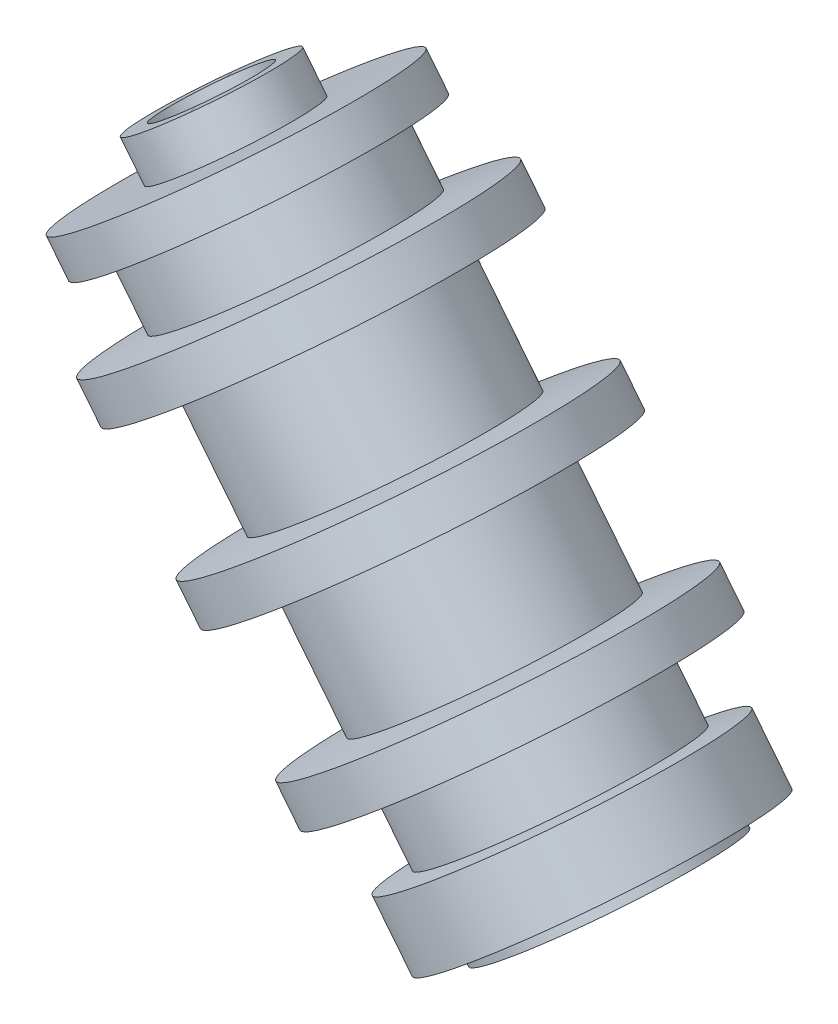
ISO-10303-21;
HEADER;
FILE_DESCRIPTION(('STEP AP214'),'2;1');
FILE_NAME('part.step','',(''),(''),'','','');
FILE_SCHEMA(('AUTOMOTIVE_DESIGN { 1 0 10303 214 1 1 1 1 }'));
ENDSEC;
DATA;
#1=APPLICATION_CONTEXT('core data for automotive mechanical design processes');
#2=APPLICATION_PROTOCOL_DEFINITION('international standard','automotive_design',2000,#1);
#3=PRODUCT_CONTEXT('',#1,'mechanical');
#4=PRODUCT('Part','Part','',(#3));
#5=PRODUCT_RELATED_PRODUCT_CATEGORY('part','',(#4));
#6=PRODUCT_DEFINITION_FORMATION('','',#4);
#7=PRODUCT_DEFINITION_CONTEXT('part definition',#1,'design');
#8=PRODUCT_DEFINITION('design','',#6,#7);
#9=PRODUCT_DEFINITION_SHAPE('','',#8);
#10=(LENGTH_UNIT() NAMED_UNIT(*) SI_UNIT(.MILLI.,.METRE.));
#11=(NAMED_UNIT(*) PLANE_ANGLE_UNIT() SI_UNIT($,.RADIAN.));
#12=(NAMED_UNIT(*) SI_UNIT($,.STERADIAN.) SOLID_ANGLE_UNIT());
#13=UNCERTAINTY_MEASURE_WITH_UNIT(LENGTH_MEASURE(1.E-05),#10,'distance_accuracy_value','');
#14=(GEOMETRIC_REPRESENTATION_CONTEXT(3) GLOBAL_UNCERTAINTY_ASSIGNED_CONTEXT((#13)) GLOBAL_UNIT_ASSIGNED_CONTEXT((#10,
#11,#12)) REPRESENTATION_CONTEXT('',''));
#15=CARTESIAN_POINT('',(0.,0.,0.));
#16=DIRECTION('',(0.,0.,1.));
#17=DIRECTION('',(1.,0.,0.));
#18=AXIS2_PLACEMENT_3D('',#15,#16,#17);
#19=CARTESIAN_POINT('',(18.608083128768,15.1592131152266,0.));
#20=DIRECTION('',(-0.623489801858733,0.78183148246803,0.));
#21=DIRECTION('',(-0.78183148246803,-0.623489801858733,0.));
#22=AXIS2_PLACEMENT_3D('',#19,#20,#21);
#23=CYLINDRICAL_SURFACE('',#22,4.5);
#24=CARTESIAN_POINT('',(19.0757004801351,14.5728395034094,0.));
#25=DIRECTION('',(-0.623489801858733,0.78183148246803,0.));
#26=DIRECTION('',(-0.614587904844371,-0.490117499242376,0.61811531622781));
#27=AXIS2_PLACEMENT_3D('',#24,#25,#26);
#28=CIRCLE('',#27,4.50000000000717);
#29=CARTESIAN_POINT('',(16.310054908331,12.3673107568152,2.78151892302958));
#30=VERTEX_POINT('',#29);
#31=EDGE_CURVE('E105',#30,#30,#28,.F.);
#32=ORIENTED_EDGE('',*,*,#31,.F.);
#33=EDGE_LOOP('',(#32));
#34=FACE_BOUND('',#33,.T.);
#35=CARTESIAN_POINT('',(18.452210678295,15.354670985854,0.));
#36=DIRECTION('',(0.623489801858733,-0.78183148246803,0.));
#37=DIRECTION('',(0.614587904837553,0.49011749923694,-0.6181153162389));
#38=AXIS2_PLACEMENT_3D('',#35,#36,#37);
#39=CIRCLE('',#38,4.5000000000184);
#40=CARTESIAN_POINT('',(21.2178562500753,17.5601997324293,-2.78151892308642));
#41=VERTEX_POINT('',#40);
#42=EDGE_CURVE('E102',#41,#41,#39,.F.);
#43=ORIENTED_EDGE('',*,*,#42,.F.);
#44=EDGE_LOOP('',(#43));
#45=FACE_BOUND('',#44,.T.);
#46=ADVANCED_FACE('F17',(#34,#45),#23,.T.);
#47=CARTESIAN_POINT('',(19.0757004801407,14.5728395034024,0.));
#48=DIRECTION('',(-0.623489801858733,0.78183148246803,0.));
#49=DIRECTION('',(-0.78183148246803,-0.623489801858733,0.));
#50=AXIS2_PLACEMENT_3D('',#47,#48,#49);
#51=CONICAL_SURFACE('',#50,4.50000000014024,1.4835298642031);
#52=ORIENTED_EDGE('',*,*,#31,.T.);
#53=EDGE_LOOP('',(#52));
#54=FACE_BOUND('',#53,.T.);
#55=CARTESIAN_POINT('',(19.1575229143921,14.4702374161202,0.));
#56=DIRECTION('',(-0.623489801858733,0.78183148246803,0.));
#57=DIRECTION('',(-0.78183148246803,-0.623489801858733,0.));
#58=AXIS2_PLACEMENT_3D('',#55,#56,#57);
#59=CIRCLE('',#58,3.);
#60=CARTESIAN_POINT('',(16.812028466988,12.599768010544,0.));
#61=VERTEX_POINT('',#60);
#62=EDGE_CURVE('E99',#61,#61,#59,.F.);
#63=ORIENTED_EDGE('',*,*,#62,.F.);
#64=EDGE_LOOP('',(#63));
#65=FACE_BOUND('',#64,.T.);
#66=ADVANCED_FACE('F229',(#54,#65),#51,.T.);
#67=CARTESIAN_POINT('',(18.452210678295,15.354670985854,0.));
#68=DIRECTION('',(0.623489801858733,-0.78183148246803,0.));
#69=DIRECTION('',(0.78183148246803,0.623489801858733,0.));
#70=AXIS2_PLACEMENT_3D('',#67,#68,#69);
#71=CONICAL_SURFACE('',#70,4.5000000000184,1.4835298642031);
#72=CARTESIAN_POINT('',(18.3703882440733,15.457273073099,0.));
#73=DIRECTION('',(-0.623489801858733,0.78183148246803,0.));
#74=DIRECTION('',(-0.78183148246803,-0.623489801858733,0.));
#75=AXIS2_PLACEMENT_3D('',#72,#73,#74);
#76=CIRCLE('',#75,3.);
#77=CARTESIAN_POINT('',(16.0248937966693,13.5868036675228,0.));
#78=VERTEX_POINT('',#77);
#79=EDGE_CURVE('E96',#78,#78,#76,.T.);
#80=ORIENTED_EDGE('',*,*,#79,.F.);
#81=EDGE_LOOP('',(#80));
#82=FACE_BOUND('',#81,.T.);
#83=ORIENTED_EDGE('',*,*,#42,.T.);
#84=EDGE_LOOP('',(#83));
#85=FACE_BOUND('',#84,.T.);
#86=ADVANCED_FACE('F219',(#82,#85),#71,.T.);
#87=CARTESIAN_POINT('',(21.3202637668535,11.7582461664907,0.));
#88=DIRECTION('',(-0.623489801858733,0.78183148246803,0.));
#89=DIRECTION('',(-0.78183148246803,-0.623489801858733,0.));
#90=AXIS2_PLACEMENT_3D('',#87,#88,#89);
#91=CYLINDRICAL_SURFACE('',#90,3.);
#92=ORIENTED_EDGE('',*,*,#62,.T.);
#93=EDGE_LOOP('',(#92));
#94=FACE_BOUND('',#93,.T.);
#95=CARTESIAN_POINT('',(20.9266964316871,12.2517639949889,0.));
#96=DIRECTION('',(0.623489801858733,-0.78183148246803,0.));
#97=DIRECTION('',(0.614587904834828,0.490117499234766,-0.618115316243333));
#98=AXIS2_PLACEMENT_3D('',#95,#96,#97);
#99=CIRCLE('',#98,2.99999999992945);
#100=CARTESIAN_POINT('',(22.7704601461483,13.7221164926586,-1.85434594868639));
#101=VERTEX_POINT('',#100);
#102=EDGE_CURVE('E79',#101,#101,#99,.T.);
#103=ORIENTED_EDGE('',*,*,#102,.F.);
#104=EDGE_LOOP('',(#103));
#105=FACE_BOUND('',#104,.T.);
#106=ADVANCED_FACE('F217',(#94,#105),#91,.T.);
#107=CARTESIAN_POINT('',(16.2076473916119,18.1692643227285,0.));
#108=DIRECTION('',(-0.623489801858733,0.78183148246803,0.));
#109=DIRECTION('',(-0.78183148246803,-0.623489801858733,0.));
#110=AXIS2_PLACEMENT_3D('',#107,#108,#109);
#111=CYLINDRICAL_SURFACE('',#110,3.);
#112=ORIENTED_EDGE('',*,*,#79,.T.);
#113=EDGE_LOOP('',(#112));
#114=FACE_BOUND('',#113,.T.);
#115=CARTESIAN_POINT('',(16.6012147268205,17.6757464941773,0.));
#116=DIRECTION('',(-0.623489801858733,0.78183148246803,0.));
#117=DIRECTION('',(-0.614587904826093,-0.4901174992278,0.618115316257542));
#118=AXIS2_PLACEMENT_3D('',#115,#116,#117);
#119=CIRCLE('',#118,3.0000000000444);
#120=CARTESIAN_POINT('',(18.4449784413525,19.1460989919035,-1.85434594873922));
#121=VERTEX_POINT('',#120);
#122=CARTESIAN_POINT('',(14.757451012301,16.2053939964866,1.85434594877972));
#123=VERTEX_POINT('',#122);
#124=EDGE_CURVE('E66',#121,#123,#119,.T.);
#125=ORIENTED_EDGE('',*,*,#124,.F.);
#126=CARTESIAN_POINT('',(16.6012147268205,17.6757464941773,0.));
#127=DIRECTION('',(-0.623489801858733,0.78183148246803,0.));
#128=DIRECTION('',(-0.614587904826093,-0.4901174992278,0.618115316257542));
#129=AXIS2_PLACEMENT_3D('',#126,#127,#128);
#130=CIRCLE('',#129,3.0000000000444);
#131=EDGE_CURVE('E72',#123,#121,#130,.T.);
#132=ORIENTED_EDGE('',*,*,#131,.F.);
#133=EDGE_LOOP('',(#125,#132));
#134=FACE_BOUND('',#133,.T.);
#135=ADVANCED_FACE('F85',(#114,#134),#111,.T.);
#136=CARTESIAN_POINT('',(21.0085188659509,12.1491619076912,0.));
#137=DIRECTION('',(0.623489801858733,-0.781831482468031,0.));
#138=DIRECTION('',(0.78183148246803,0.623489801858733,0.));
#139=AXIS2_PLACEMENT_3D('',#136,#137,#138);
#140=CONICAL_SURFACE('',#139,4.50000000041666,1.48352986419527);
#141=CARTESIAN_POINT('',(21.0085188659241,12.1491619077247,0.));
#142=DIRECTION('',(-0.623489801858733,0.78183148246803,0.));
#143=DIRECTION('',(-0.78183148246803,-0.623489801858733,0.));
#144=AXIS2_PLACEMENT_3D('',#141,#142,#143);
#145=CIRCLE('',#144,4.5);
#146=CARTESIAN_POINT('',(17.490277194818,9.34345779936039,0.));
#147=VERTEX_POINT('',#146);
#148=EDGE_CURVE('E87',#147,#147,#145,.F.);
#149=ORIENTED_EDGE('',*,*,#148,.F.);
#150=EDGE_LOOP('',(#149));
#151=FACE_BOUND('',#150,.T.);
#152=ORIENTED_EDGE('',*,*,#102,.T.);
#153=EDGE_LOOP('',(#152));
#154=FACE_BOUND('',#153,.T.);
#155=ADVANCED_FACE('F211',(#151,#154),#140,.T.);
#156=CARTESIAN_POINT('',(16.5193922925841,17.7783485814408,0.));
#157=DIRECTION('',(-0.623489801858734,0.78183148246803,0.));
#158=DIRECTION('',(-0.78183148246803,-0.623489801858733,0.));
#159=AXIS2_PLACEMENT_3D('',#156,#157,#158);
#160=CONICAL_SURFACE('',#159,4.50000000009767,1.4835298642031);
#161=CARTESIAN_POINT('',(16.5193922925413,17.7783485814945,0.));
#162=DIRECTION('',(-0.623489801858733,0.78183148246803,0.));
#163=DIRECTION('',(-0.78183148246803,-0.623489801858733,0.));
#164=AXIS2_PLACEMENT_3D('',#161,#162,#163);
#165=CIRCLE('',#164,4.5);
#166=CARTESIAN_POINT('',(13.7537467207935,15.5728198349261,2.78151892308008));
#167=VERTEX_POINT('',#166);
#168=CARTESIAN_POINT('',(19.2850378643123,19.9838773280433,-2.78151892307249));
#169=VERTEX_POINT('',#168);
#170=EDGE_CURVE('E173',#167,#169,#165,.T.);
#171=ORIENTED_EDGE('',*,*,#170,.F.);
#172=CARTESIAN_POINT('',(14.757451012315,16.2053939964721,1.85434594880007));
#173=CARTESIAN_POINT('',(14.7156300002068,16.1790367397749,1.89297815605056));
#174=CARTESIAN_POINT('',(14.6738089880922,16.1526794830616,1.93161036328324));
#175=CARTESIAN_POINT('',(14.590166963787,16.099964969578,2.00887477780492));
#176=CARTESIAN_POINT('',(14.5483459515963,16.0736077128077,2.04750698509391));
#177=CARTESIAN_POINT('',(14.4647039272943,16.0208931993226,2.12477139961806));
#178=CARTESIAN_POINT('',(14.4228829151829,15.9945359426079,2.1634036068532));
#179=CARTESIAN_POINT('',(14.3392408908988,15.9418214291803,2.24066802138961));
#180=CARTESIAN_POINT('',(14.297419878726,15.9154641724675,2.27930022869086));
#181=CARTESIAN_POINT('',(14.2326074279115,15.8746168013081,2.33917080341531));
#182=CARTESIAN_POINT('',(14.2096159892687,15.8601266868842,2.36040917085277));
#183=CARTESIAN_POINT('',(14.1510800629909,15.8232350298271,2.41448179895969));
#184=CARTESIAN_POINT('',(14.1155355753637,15.800833487199,2.44731605964101));
#185=CARTESIAN_POINT('',(14.0318935510913,15.7481189737253,2.5245804741844));
#186=CARTESIAN_POINT('',(13.9837960144365,15.7178060028767,2.56901062803418));
#187=CARTESIAN_POINT('',(13.8750478921275,15.6492686329801,2.66946682893257));
#188=CARTESIAN_POINT('',(13.8143973064722,15.6110442339342,2.72549287598148));
#189=CARTESIAN_POINT('',(13.7537467208517,15.5728198349152,2.78151892308642));
#190=B_SPLINE_CURVE_WITH_KNOTS('',3,(#172,#173,#174,#175,#176,#177,#178,#179,#180,#181,#182,
#183,#184,#185,#186,#187,#188,#189),.UNSPECIFIED.,.F.,.F.,(4,2,2,2,2,2,2,2,4),(0.,
0.188216219393084,0.376432439114383,0.564648658507466,0.752864878143112,0.856338262472878,
1.01630687028567,1.23277070154937,1.50572975623721),.UNSPECIFIED.);
#191=EDGE_CURVE('E77',#123,#167,#190,.T.);
#192=ORIENTED_EDGE('',*,*,#191,.F.);
#193=ORIENTED_EDGE('',*,*,#131,.T.);
#194=CARTESIAN_POINT('',(19.285037864324,19.9838773279952,-2.78151892305608));
#195=CARTESIAN_POINT('',(19.2500353883676,19.9489698973092,-2.74288671580794));
#196=CARTESIAN_POINT('',(19.2150329124129,19.9140624666333,-2.70425450854927));
#197=CARTESIAN_POINT('',(19.1450279605076,19.8442476052997,-2.62699009403211));
#198=CARTESIAN_POINT('',(19.1100254845569,19.8093401746422,-2.58835788677361));
#199=CARTESIAN_POINT('',(19.0400205326286,19.7395253133117,-2.51109347224262));
#200=CARTESIAN_POINT('',(19.0050180566509,19.7046178826388,-2.47246126497012));
#201=CARTESIAN_POINT('',(18.935013104724,19.6348030213107,-2.3951968504357));
#202=CARTESIAN_POINT('',(18.9000106287749,19.5998955906554,-2.35656464317378));
#203=CARTESIAN_POINT('',(18.8300056768638,19.5300807293139,-2.279300228669));
#204=CARTESIAN_POINT('',(18.7950032009018,19.4951732986277,-2.24066802142615));
#205=CARTESIAN_POINT('',(18.7249982489937,19.4253584372691,-2.16340360687571));
#206=CARTESIAN_POINT('',(18.6899957730475,19.3904510065968,-2.12477139956812));
#207=CARTESIAN_POINT('',(18.6199908211433,19.3206361452659,-2.04750698500959));
#208=CARTESIAN_POINT('',(18.5849883451854,19.2857287146073,-2.00887477775864));
#209=CARTESIAN_POINT('',(18.5149833932652,19.2159138532716,-1.93161036325692));
#210=CARTESIAN_POINT('',(18.4799809173029,19.1810064225945,-1.89297815600615));
#211=CARTESIAN_POINT('',(18.4449784413593,19.1460989919089,-1.85434594874608));
#212=B_SPLINE_CURVE_WITH_KNOTS('',3,(#194,#195,#196,#197,#198,#199,#200,#201,#202,#203,#204,
#205,#206,#207,#208,#209,#210,#211),.UNSPECIFIED.,.F.,.F.,(4,2,2,2,2,2,2,2,4),(0.,
0.188216219527751,0.376432439017607,0.564648658604242,0.752864878094098,0.941081097621853,
1.1292973172196,1.31751353670946,1.50572975623721),.UNSPECIFIED.);
#213=EDGE_CURVE('E75',#169,#121,#212,.T.);
#214=ORIENTED_EDGE('',*,*,#213,.F.);
#215=EDGE_LOOP('',(#171,#192,#193,#214));
#216=FACE_BOUND('',#215,.T.);
#217=ADVANCED_FACE('F74',(#216),#160,.T.);
#218=CARTESIAN_POINT('',(16.5193922925785,17.7783485814478,0.));
#219=DIRECTION('',(-0.623489801858733,0.78183148246803,0.));
#220=DIRECTION('',(-0.78183148246803,-0.623489801858733,0.));
#221=AXIS2_PLACEMENT_3D('',#218,#219,#220);
#222=CONICAL_SURFACE('',#221,4.49999999996461,1.48352986418944);
#223=ORIENTED_EDGE('',*,*,#191,.T.);
#224=CARTESIAN_POINT('',(16.5193922925413,17.7783485814945,0.));
#225=DIRECTION('',(-0.623489801858733,0.78183148246803,0.));
#226=DIRECTION('',(-0.78183148246803,-0.623489801858733,0.));
#227=AXIS2_PLACEMENT_3D('',#224,#225,#226);
#228=CIRCLE('',#227,4.5);
#229=EDGE_CURVE('E83',#169,#167,#228,.T.);
#230=ORIENTED_EDGE('',*,*,#229,.F.);
#231=ORIENTED_EDGE('',*,*,#213,.T.);
#232=ORIENTED_EDGE('',*,*,#124,.T.);
#233=EDGE_LOOP('',(#223,#230,#231,#232));
#234=FACE_BOUND('',#233,.T.);
#235=ADVANCED_FACE('F81',(#234),#222,.T.);
#236=CARTESIAN_POINT('',(21.3202637668535,11.7582461664907,0.));
#237=DIRECTION('',(-0.623489801858733,0.78183148246803,0.));
#238=DIRECTION('',(-0.78183148246803,-0.623489801858733,0.));
#239=AXIS2_PLACEMENT_3D('',#236,#237,#238);
#240=CYLINDRICAL_SURFACE('',#239,4.5);
#241=ORIENTED_EDGE('',*,*,#148,.T.);
#242=EDGE_LOOP('',(#241));
#243=FACE_BOUND('',#242,.T.);
#244=CARTESIAN_POINT('',(21.6320086677857,11.3673304252531,0.));
#245=DIRECTION('',(-0.623489801858733,0.78183148246803,0.));
#246=DIRECTION('',(-0.614587904839636,-0.490117499238599,0.618115316235514));
#247=AXIS2_PLACEMENT_3D('',#244,#245,#246);
#248=CIRCLE('',#247,4.50000000004305);
#249=CARTESIAN_POINT('',(18.8663630959809,9.16180167865832,2.78151892308642));
#250=VERTEX_POINT('',#249);
#251=EDGE_CURVE('E170',#250,#250,#248,.F.);
#252=ORIENTED_EDGE('',*,*,#251,.F.);
#253=EDGE_LOOP('',(#252));
#254=FACE_BOUND('',#253,.T.);
#255=ADVANCED_FACE('F186',(#243,#254),#240,.T.);
#256=CARTESIAN_POINT('',(16.2076473916119,18.1692643227285,0.));
#257=DIRECTION('',(-0.623489801858733,0.78183148246803,0.));
#258=DIRECTION('',(-0.78183148246803,-0.623489801858733,0.));
#259=AXIS2_PLACEMENT_3D('',#256,#257,#258);
#260=CYLINDRICAL_SURFACE('',#259,4.5);
#261=ORIENTED_EDGE('',*,*,#170,.T.);
#262=ORIENTED_EDGE('',*,*,#229,.T.);
#263=EDGE_LOOP('',(#261,#262));
#264=FACE_BOUND('',#263,.T.);
#265=CARTESIAN_POINT('',(15.8959024906721,18.5601800639756,0.));
#266=DIRECTION('',(0.623489801858733,-0.78183148246803,0.));
#267=DIRECTION('',(0.614587904835263,0.490117499235114,-0.618115316242624));
#268=AXIS2_PLACEMENT_3D('',#265,#266,#267);
#269=CIRCLE('',#268,4.49999999999129);
#270=CARTESIAN_POINT('',(18.6615480624255,20.7657088105293,-2.78151892308642));
#271=VERTEX_POINT('',#270);
#272=EDGE_CURVE('E167',#271,#271,#269,.F.);
#273=ORIENTED_EDGE('',*,*,#272,.F.);
#274=EDGE_LOOP('',(#273));
#275=FACE_BOUND('',#274,.T.);
#276=ADVANCED_FACE('F334',(#264,#275),#260,.T.);
#277=CARTESIAN_POINT('',(21.6320086677857,11.3673304252531,0.));
#278=DIRECTION('',(-0.623489801858733,0.78183148246803,0.));
#279=DIRECTION('',(-0.78183148246803,-0.623489801858733,0.));
#280=AXIS2_PLACEMENT_3D('',#277,#278,#279);
#281=CONICAL_SURFACE('',#280,4.50000000004305,1.48352986421654);
#282=ORIENTED_EDGE('',*,*,#251,.T.);
#283=EDGE_LOOP('',(#282));
#284=FACE_BOUND('',#283,.T.);
#285=CARTESIAN_POINT('',(21.7138311020129,11.2647283380012,0.));
#286=DIRECTION('',(-0.623489801858733,0.78183148246803,0.));
#287=DIRECTION('',(-0.78183148246803,-0.623489801858733,0.));
#288=AXIS2_PLACEMENT_3D('',#285,#286,#287);
#289=CIRCLE('',#288,3.);
#290=CARTESIAN_POINT('',(19.3683366546088,9.39425893242503,0.));
#291=VERTEX_POINT('',#290);
#292=EDGE_CURVE('E164',#291,#291,#289,.F.);
#293=ORIENTED_EDGE('',*,*,#292,.F.);
#294=EDGE_LOOP('',(#293));
#295=FACE_BOUND('',#294,.T.);
#296=ADVANCED_FACE('F331',(#284,#295),#281,.T.);
#297=CARTESIAN_POINT('',(15.8959024906721,18.5601800639756,0.));
#298=DIRECTION('',(0.623489801858733,-0.78183148246803,0.));
#299=DIRECTION('',(0.78183148246803,0.623489801858733,0.));
#300=AXIS2_PLACEMENT_3D('',#297,#298,#299);
#301=CONICAL_SURFACE('',#300,4.49999999999129,1.48352986421263);
#302=CARTESIAN_POINT('',(15.8140800564525,18.662782151218,0.));
#303=DIRECTION('',(-0.623489801858733,0.78183148246803,0.));
#304=DIRECTION('',(-0.78183148246803,-0.623489801858733,0.));
#305=AXIS2_PLACEMENT_3D('',#302,#303,#304);
#306=CIRCLE('',#305,3.);
#307=CARTESIAN_POINT('',(13.4685856090484,16.7923127456418,0.));
#308=VERTEX_POINT('',#307);
#309=EDGE_CURVE('E161',#308,#308,#306,.T.);
#310=ORIENTED_EDGE('',*,*,#309,.F.);
#311=EDGE_LOOP('',(#310));
#312=FACE_BOUND('',#311,.T.);
#313=ORIENTED_EDGE('',*,*,#272,.T.);
#314=EDGE_LOOP('',(#313));
#315=FACE_BOUND('',#314,.T.);
#316=ADVANCED_FACE('F327',(#312,#315),#301,.T.);
#317=CARTESIAN_POINT('',(21.3202637668535,11.7582461664907,0.));
#318=DIRECTION('',(-0.623489801858733,0.78183148246803,0.));
#319=DIRECTION('',(-0.78183148246803,-0.623489801858733,0.));
#320=AXIS2_PLACEMENT_3D('',#317,#318,#319);
#321=CYLINDRICAL_SURFACE('',#320,3.);
#322=ORIENTED_EDGE('',*,*,#292,.T.);
#323=EDGE_LOOP('',(#322));
#324=FACE_BOUND('',#323,.T.);
#325=CARTESIAN_POINT('',(22.6144007947929,10.1354496619539,0.));
#326=DIRECTION('',(0.623489801858733,-0.78183148246803,0.));
#327=DIRECTION('',(0.614587904829585,0.490117499230585,-0.618115316251861));
#328=AXIS2_PLACEMENT_3D('',#325,#326,#327);
#329=CIRCLE('',#328,2.99999999998002);
#330=CARTESIAN_POINT('',(24.4581645092694,11.6058021596359,-1.85434594874323));
#331=VERTEX_POINT('',#330);
#332=EDGE_CURVE('E153',#331,#331,#329,.T.);
#333=ORIENTED_EDGE('',*,*,#332,.F.);
#334=EDGE_LOOP('',(#333));
#335=FACE_BOUND('',#334,.T.);
#336=ADVANCED_FACE('F323',(#324,#335),#321,.T.);
#337=CARTESIAN_POINT('',(16.2076473916119,18.1692643227285,0.));
#338=DIRECTION('',(-0.623489801858733,0.78183148246803,0.));
#339=DIRECTION('',(-0.78183148246803,-0.623489801858733,0.));
#340=AXIS2_PLACEMENT_3D('',#337,#338,#339);
#341=CYLINDRICAL_SURFACE('',#340,3.);
#342=ORIENTED_EDGE('',*,*,#309,.T.);
#343=EDGE_LOOP('',(#342));
#344=FACE_BOUND('',#343,.T.);
#345=CARTESIAN_POINT('',(14.9135103636372,19.7920608273095,0.));
#346=DIRECTION('',(-0.623489801858733,0.78183148246803,0.));
#347=DIRECTION('',(-0.614587904839811,-0.49011749923874,0.618115316235227));
#348=AXIS2_PLACEMENT_3D('',#345,#346,#347);
#349=CIRCLE('',#348,2.99999999996878);
#350=CARTESIAN_POINT('',(16.757274078147,21.2624133250188,-1.85434594868645));
#351=VERTEX_POINT('',#350);
#352=CARTESIAN_POINT('',(13.0697466491603,18.3217083296079,1.85434594868209));
#353=VERTEX_POINT('',#352);
#354=EDGE_CURVE('E141',#351,#353,#349,.T.);
#355=ORIENTED_EDGE('',*,*,#354,.F.);
#356=CARTESIAN_POINT('',(14.9135103636372,19.7920608273095,0.));
#357=DIRECTION('',(-0.623489801858733,0.78183148246803,0.));
#358=DIRECTION('',(-0.614587904839811,-0.49011749923874,0.618115316235227));
#359=AXIS2_PLACEMENT_3D('',#356,#357,#358);
#360=CIRCLE('',#359,2.99999999996878);
#361=EDGE_CURVE('E147',#353,#351,#360,.T.);
#362=ORIENTED_EDGE('',*,*,#361,.F.);
#363=EDGE_LOOP('',(#355,#362));
#364=FACE_BOUND('',#363,.T.);
#365=ADVANCED_FACE('F319',(#344,#364),#341,.T.);
#366=CARTESIAN_POINT('',(22.6607668408964,10.077308479126,0.));
#367=DIRECTION('',(0.623489801858733,-0.78183148246803,0.));
#368=DIRECTION('',(0.78183148246803,0.623489801858733,0.));
#369=AXIS2_PLACEMENT_3D('',#366,#367,#368);
#370=CONICAL_SURFACE('',#369,3.85000000096911,1.48352986420438);
#371=CARTESIAN_POINT('',(22.6607668408498,10.0773084791844,0.));
#372=DIRECTION('',(-0.623489801858733,0.78183148246803,0.));
#373=DIRECTION('',(-0.78183148246803,-0.623489801858733,0.));
#374=AXIS2_PLACEMENT_3D('',#371,#372,#373);
#375=CIRCLE('',#374,3.85);
#376=CARTESIAN_POINT('',(19.6507156333479,7.67687274202829,0.));
#377=VERTEX_POINT('',#376);
#378=EDGE_CURVE('E132',#377,#377,#375,.F.);
#379=ORIENTED_EDGE('',*,*,#378,.F.);
#380=EDGE_LOOP('',(#379));
#381=FACE_BOUND('',#380,.T.);
#382=ORIENTED_EDGE('',*,*,#332,.T.);
#383=EDGE_LOOP('',(#382));
#384=FACE_BOUND('',#383,.T.);
#385=ADVANCED_FACE('F315',(#381,#384),#370,.T.);
#386=CARTESIAN_POINT('',(14.8671443175169,19.8502020101586,0.));
#387=DIRECTION('',(-0.623489801858733,0.78183148246803,0.));
#388=DIRECTION('',(-0.78183148246803,-0.623489801858733,0.));
#389=AXIS2_PLACEMENT_3D('',#386,#387,#388);
#390=CONICAL_SURFACE('',#389,3.85000000066407,1.48352986418066);
#391=CARTESIAN_POINT('',(14.8671443176156,19.8502020100348,0.));
#392=DIRECTION('',(-0.623489801858733,0.78183148246803,0.));
#393=DIRECTION('',(-0.78183148246803,-0.623489801858733,0.));
#394=AXIS2_PLACEMENT_3D('',#391,#392,#393);
#395=CIRCLE('',#394,3.85);
#396=CARTESIAN_POINT('',(12.5009808839658,17.9632496379806,2.37974396752612));
#397=VERTEX_POINT('',#396);
#398=CARTESIAN_POINT('',(17.2333077512036,21.7371543820813,-2.37974396749769));
#399=VERTEX_POINT('',#398);
#400=EDGE_CURVE('E130',#397,#399,#395,.T.);
#401=ORIENTED_EDGE('',*,*,#400,.F.);
#402=DIRECTION('',(0.666589929087877,0.420111350621766,-0.615763200847025));
#403=VECTOR('',#402,1.);
#404=CARTESIAN_POINT('',(-499000.,-314479.461053014,460965.74186245));
#405=LINE('',#404,#403);
#406=EDGE_CURVE('E139',#353,#397,#405,.F.);
#407=ORIENTED_EDGE('',*,*,#406,.F.);
#408=ORIENTED_EDGE('',*,*,#361,.T.);
#409=DIRECTION('',(-0.557908495529008,-0.556393557738626,0.61576320085201));
#410=VECTOR('',#409,1.);
#411=CARTESIAN_POINT('',(417670.278341545,416540.692303794,-460965.741866181));
#412=LINE('',#411,#410);
#413=EDGE_CURVE('E144',#399,#351,#412,.T.);
#414=ORIENTED_EDGE('',*,*,#413,.F.);
#415=EDGE_LOOP('',(#401,#407,#408,#414));
#416=FACE_BOUND('',#415,.T.);
#417=ADVANCED_FACE('F311',(#416),#390,.T.);
#418=CARTESIAN_POINT('',(14.8671443175608,19.8502020101036,0.));
#419=DIRECTION('',(-0.623489801858733,0.78183148246803,0.));
#420=DIRECTION('',(-0.78183148246803,-0.623489801858733,0.));
#421=AXIS2_PLACEMENT_3D('',#418,#419,#420);
#422=CONICAL_SURFACE('',#421,3.85000000006213,1.48352986420128);
#423=ORIENTED_EDGE('',*,*,#406,.T.);
#424=CARTESIAN_POINT('',(14.8671443176156,19.8502020100348,0.));
#425=DIRECTION('',(-0.623489801858733,0.78183148246803,0.));
#426=DIRECTION('',(-0.78183148246803,-0.623489801858733,0.));
#427=AXIS2_PLACEMENT_3D('',#424,#425,#426);
#428=CIRCLE('',#427,3.85);
#429=EDGE_CURVE('E127',#399,#397,#428,.T.);
#430=ORIENTED_EDGE('',*,*,#429,.F.);
#431=ORIENTED_EDGE('',*,*,#413,.T.);
#432=ORIENTED_EDGE('',*,*,#354,.T.);
#433=EDGE_LOOP('',(#423,#430,#431,#432));
#434=FACE_BOUND('',#433,.T.);
#435=ADVANCED_FACE('F307',(#434),#422,.T.);
#436=CARTESIAN_POINT('',(23.2141211081754,9.3834241752817,0.));
#437=DIRECTION('',(-0.623489801858733,0.78183148246803,0.));
#438=DIRECTION('',(-0.78183148246803,-0.623489801858733,0.));
#439=AXIS2_PLACEMENT_3D('',#436,#437,#438);
#440=CYLINDRICAL_SURFACE('',#439,3.85);
#441=ORIENTED_EDGE('',*,*,#378,.T.);
#442=EDGE_LOOP('',(#441));
#443=FACE_BOUND('',#442,.T.);
#444=CARTESIAN_POINT('',(23.6895250139167,8.78728653311216,0.));
#445=DIRECTION('',(-0.623489801858733,0.78183148246803,0.));
#446=DIRECTION('',(-0.78183148246803,-0.623489801858733,0.));
#447=AXIS2_PLACEMENT_3D('',#444,#445,#446);
#448=CIRCLE('',#447,3.85);
#449=CARTESIAN_POINT('',(20.6794738064148,6.38685079595604,0.));
#450=VERTEX_POINT('',#449);
#451=EDGE_CURVE('E20',#450,#450,#448,.T.);
#452=ORIENTED_EDGE('',*,*,#451,.T.);
#453=EDGE_LOOP('',(#452));
#454=FACE_BOUND('',#453,.T.);
#455=ADVANCED_FACE('F303',(#443,#454),#440,.T.);
#456=CARTESIAN_POINT('',(14.31379005029,20.5440863139375,0.));
#457=DIRECTION('',(-0.623489801858733,0.78183148246803,0.));
#458=DIRECTION('',(-0.78183148246803,-0.623489801858733,0.));
#459=AXIS2_PLACEMENT_3D('',#456,#457,#458);
#460=CYLINDRICAL_SURFACE('',#459,3.85);
#461=ORIENTED_EDGE('',*,*,#400,.T.);
#462=ORIENTED_EDGE('',*,*,#429,.T.);
#463=EDGE_LOOP('',(#461,#462));
#464=FACE_BOUND('',#463,.T.);
#465=CARTESIAN_POINT('',(14.2887038441946,20.5755434214036,0.));
#466=DIRECTION('',(0.623489801858733,-0.78183148246803,0.));
#467=DIRECTION('',(0.61458790483327,0.490117499233523,-0.618115316245868));
#468=AXIS2_PLACEMENT_3D('',#465,#466,#467);
#469=CIRCLE('',#468,3.8500000000776);
#470=CARTESIAN_POINT('',(16.6548672778504,22.4624957934907,-2.37974396759455));
#471=VERTEX_POINT('',#470);
#472=EDGE_CURVE('E117',#471,#471,#469,.F.);
#473=ORIENTED_EDGE('',*,*,#472,.F.);
#474=EDGE_LOOP('',(#473));
#475=FACE_BOUND('',#474,.T.);
#476=ADVANCED_FACE('F297',(#464,#475),#460,.T.);
#477=CARTESIAN_POINT('',(21.9379494851308,7.39045166028779,1.76162865128272));
#478=DIRECTION('',(-0.623489801858733,0.78183148246803,0.));
#479=DIRECTION('',(-0.78183148246803,-0.623489801858733,0.));
#480=AXIS2_PLACEMENT_3D('',#477,#478,#479);
#481=PLANE('',#480);
#482=ORIENTED_EDGE('',*,*,#451,.F.);
#483=EDGE_LOOP('',(#482));
#484=FACE_BOUND('',#483,.T.);
#485=CARTESIAN_POINT('',(23.6895250139167,8.78728653311216,0.));
#486=DIRECTION('',(-0.623489801858733,0.78183148246803,0.));
#487=DIRECTION('',(-0.78183148246803,-0.623489801858733,0.));
#488=AXIS2_PLACEMENT_3D('',#485,#486,#487);
#489=CIRCLE('',#488,2.85);
#490=CARTESIAN_POINT('',(21.4613052888828,7.01034059781477,0.));
#491=VERTEX_POINT('',#490);
#492=EDGE_CURVE('E114',#491,#491,#489,.F.);
#493=ORIENTED_EDGE('',*,*,#492,.F.);
#494=EDGE_LOOP('',(#493));
#495=FACE_BOUND('',#494,.T.);
#496=ADVANCED_FACE('F290',(#484,#495),#481,.F.);
#497=CARTESIAN_POINT('',(14.2887038441781,20.5755434214243,0.));
#498=DIRECTION('',(0.623489801858733,-0.78183148246803,0.));
#499=DIRECTION('',(0.78183148246803,0.623489801858733,0.));
#500=AXIS2_PLACEMENT_3D('',#497,#498,#499);
#501=CONICAL_SURFACE('',#500,3.84999999994473,1.56206968053369);
#502=CARTESIAN_POINT('',(14.2778216180382,20.5891893013892,0.));
#503=DIRECTION('',(-0.623489801858733,0.78183148246803,0.));
#504=DIRECTION('',(-0.78183148246803,-0.623489801858733,0.));
#505=AXIS2_PLACEMENT_3D('',#502,#503,#504);
#506=CIRCLE('',#505,1.85);
#507=CARTESIAN_POINT('',(12.8314333754723,19.4357331679506,0.));
#508=VERTEX_POINT('',#507);
#509=EDGE_CURVE('E116',#508,#508,#506,.T.);
#510=ORIENTED_EDGE('',*,*,#509,.F.);
#511=EDGE_LOOP('',(#510));
#512=FACE_BOUND('',#511,.T.);
#513=ORIENTED_EDGE('',*,*,#472,.T.);
#514=EDGE_LOOP('',(#513));
#515=FACE_BOUND('',#514,.T.);
#516=ADVANCED_FACE('F288',(#512,#515),#501,.T.);
#517=CARTESIAN_POINT('',(23.7557743394522,8.70421250649376,0.));
#518=DIRECTION('',(-0.623489801858733,0.78183148246803,0.));
#519=DIRECTION('',(-0.78183148246803,-0.623489801858733,0.));
#520=AXIS2_PLACEMENT_3D('',#517,#518,#519);
#521=CYLINDRICAL_SURFACE('',#520,2.85);
#522=ORIENTED_EDGE('',*,*,#492,.T.);
#523=EDGE_LOOP('',(#522));
#524=FACE_BOUND('',#523,.T.);
#525=CARTESIAN_POINT('',(23.8765719544743,8.55273708837175,0.));
#526=DIRECTION('',(-0.623489801858733,0.78183148246803,0.));
#527=DIRECTION('',(-0.78183148246803,-0.623489801858733,0.));
#528=AXIS2_PLACEMENT_3D('',#525,#526,#527);
#529=CIRCLE('',#528,2.85);
#530=CARTESIAN_POINT('',(21.6483522294404,6.77579115307436,0.));
#531=VERTEX_POINT('',#530);
#532=EDGE_CURVE('E110',#531,#531,#529,.T.);
#533=ORIENTED_EDGE('',*,*,#532,.T.);
#534=EDGE_LOOP('',(#533));
#535=FACE_BOUND('',#534,.T.);
#536=ADVANCED_FACE('F284',(#524,#535),#521,.T.);
#537=CARTESIAN_POINT('',(13.9660767171088,20.9801050426232,0.));
#538=DIRECTION('',(-0.623489801858733,0.78183148246803,0.));
#539=DIRECTION('',(-0.78183148246803,-0.623489801858733,0.));
#540=AXIS2_PLACEMENT_3D('',#537,#538,#539);
#541=CYLINDRICAL_SURFACE('',#540,1.85);
#542=CARTESIAN_POINT('',(13.6543318161922,21.3710207838412,0.));
#543=DIRECTION('',(0.623489801858733,-0.78183148246803,0.));
#544=DIRECTION('',(0.483262014038777,0.385388596053638,0.786087435225236));
#545=AXIS2_PLACEMENT_3D('',#542,#543,#544);
#546=CIRCLE('',#545,1.84999999998761);
#547=CARTESIAN_POINT('',(14.5483665422119,22.0839896865751,1.45426175524952));
#548=VERTEX_POINT('',#547);
#549=CARTESIAN_POINT('',(12.7602970902379,20.6580518811559,-1.45426175517243));
#550=VERTEX_POINT('',#549);
#551=EDGE_CURVE('E113',#548,#550,#546,.F.);
#552=ORIENTED_EDGE('',*,*,#551,.F.);
#553=CARTESIAN_POINT('',(13.6543318161922,21.3710207838412,0.));
#554=DIRECTION('',(0.623489801858733,-0.78183148246803,0.));
#555=DIRECTION('',(0.483262014038777,0.385388596053638,0.786087435225236));
#556=AXIS2_PLACEMENT_3D('',#553,#554,#555);
#557=CIRCLE('',#556,1.84999999998761);
#558=EDGE_CURVE('E256',#550,#548,#557,.F.);
#559=ORIENTED_EDGE('',*,*,#558,.F.);
#560=EDGE_LOOP('',(#552,#559));
#561=FACE_BOUND('',#560,.T.);
#562=ORIENTED_EDGE('',*,*,#509,.T.);
#563=EDGE_LOOP('',(#562));
#564=FACE_BOUND('',#563,.T.);
#565=ADVANCED_FACE('F281',(#561,#564),#541,.T.);
#566=CARTESIAN_POINT('',(13.6543318161866,21.3710207838483,0.));
#567=DIRECTION('',(0.623489801858733,-0.78183148246803,0.));
#568=DIRECTION('',(0.78183148246803,0.623489801858733,0.));
#569=AXIS2_PLACEMENT_3D('',#566,#567,#568);
#570=CONICAL_SURFACE('',#569,1.85000000008167,1.56206968057831);
#571=DIRECTION('',(-0.488684518780585,-0.378551241449849,-0.786057503431502));
#572=VECTOR('',#571,1.);
#573=CARTESIAN_POINT('',(310237.226900588,240330.863113684,499000.));
#574=LINE('',#573,#572);
#575=CARTESIAN_POINT('',(14.2795798222075,21.8757785757513,1.02191366581009));
#576=VERTEX_POINT('',#575);
#577=EDGE_CURVE('E252',#548,#576,#574,.T.);
#578=ORIENTED_EDGE('',*,*,#577,.F.);
#579=ORIENTED_EDGE('',*,*,#551,.T.);
#580=CARTESIAN_POINT('',(13.0230985851931,20.8737682254973,-1.02191366674217));
#581=CARTESIAN_POINT('',(13.012148522907,20.8647800444846,-1.03992817042138));
#582=CARTESIAN_POINT('',(13.0011984606262,20.8557918634825,-1.0579426741092));
#583=CARTESIAN_POINT('',(12.9792983360646,20.8378155014783,-1.09397168148471));
#584=CARTESIAN_POINT('',(12.9683482737837,20.8288273204761,-1.11198618517241));
#585=CARTESIAN_POINT('',(12.9464481492048,20.8108509584452,-1.14801519254043));
#586=CARTESIAN_POINT('',(12.9354980869067,20.8018627774164,-1.16602969622076));
#587=CARTESIAN_POINT('',(12.9135979623235,20.7838864153876,-1.20205870356826));
#588=CARTESIAN_POINT('',(12.9026479000382,20.7748982343875,-1.22007320723542));
#589=CARTESIAN_POINT('',(12.8807477754474,20.7569218723422,-1.25610221462436));
#590=CARTESIAN_POINT('',(12.8697977131419,20.747933691297,-1.27411671834615));
#591=CARTESIAN_POINT('',(12.8478975885644,20.7299573292663,-1.31014572571515));
#592=CARTESIAN_POINT('',(12.8369475262924,20.7209691482808,-1.32816022936238));
#593=CARTESIAN_POINT('',(12.8150474017132,20.7029927862763,-1.36418923671264));
#594=CARTESIAN_POINT('',(12.8040973394058,20.6940046052572,-1.38220374041566));
#595=CARTESIAN_POINT('',(12.7821972148096,20.6760282432146,-1.41823274780264));
#596=CARTESIAN_POINT('',(12.7712471525206,20.6670400621912,-1.4362472514866));
#597=CARTESIAN_POINT('',(12.7602970902394,20.6580518811571,-1.45426175516999));
#598=B_SPLINE_CURVE_WITH_KNOTS('',3,(#580,#581,#582,#583,#584,#585,#586,#587,#588,#589,#590,
#591,#592,#593,#594,#595,#596,#597),.UNSPECIFIED.,.F.,.F.,(4,2,2,2,2,2,2,2,4),(0.,
0.0687526177186871,0.137505235437375,0.206257853194599,0.275010470868606,0.343763088753733,
0.41251570634452,0.481268324157186,0.550020941903651),.UNSPECIFIED.);
#599=CARTESIAN_POINT('',(13.023098585541,20.8737682258448,-1.02191366612077));
#600=VERTEX_POINT('',#599);
#601=EDGE_CURVE('E112',#600,#550,#598,.T.);
#602=ORIENTED_EDGE('',*,*,#601,.F.);
#603=CARTESIAN_POINT('',(13.6513392039612,21.3747734008849,0.));
#604=DIRECTION('',(0.623489801858734,-0.78183148246803,0.));
#605=DIRECTION('',(0.614587904840088,0.490117499239102,-0.618115316234665));
#606=AXIS2_PLACEMENT_3D('',#603,#604,#605);
#607=CIRCLE('',#606,1.3000000000103);
#608=EDGE_CURVE('E34',#600,#576,#607,.T.);
#609=ORIENTED_EDGE('',*,*,#608,.T.);
#610=EDGE_LOOP('',(#578,#579,#602,#609));
#611=FACE_BOUND('',#610,.T.);
#612=ADVANCED_FACE('F279',(#611),#570,.T.);
#613=CARTESIAN_POINT('',(23.077607678186,7.91558433936414,0.803549911111418));
#614=DIRECTION('',(-0.623489801858733,0.78183148246803,0.));
#615=DIRECTION('',(-0.78183148246803,-0.623489801858733,0.));
#616=AXIS2_PLACEMENT_3D('',#613,#614,#615);
#617=PLANE('',#616);
#618=ORIENTED_EDGE('',*,*,#532,.F.);
#619=EDGE_LOOP('',(#618));
#620=FACE_BOUND('',#619,.T.);
#621=CARTESIAN_POINT('',(23.876571954466,8.55273708838217,0.));
#622=DIRECTION('',(0.623489801858716,-0.781831482468044,0.));
#623=DIRECTION('',(0.781831482468044,0.623489801858716,0.));
#624=AXIS2_PLACEMENT_3D('',#621,#622,#623);
#625=CIRCLE('',#624,1.357247031981);
#626=CARTESIAN_POINT('',(24.9377104135551,9.39896677142534,0.));
#627=VERTEX_POINT('',#626);
#628=EDGE_CURVE('E26',#627,#627,#625,.F.);
#629=ORIENTED_EDGE('',*,*,#628,.T.);
#630=EDGE_LOOP('',(#629));
#631=FACE_BOUND('',#630,.T.);
#632=ADVANCED_FACE('F240',(#620,#631),#617,.F.);
#633=CARTESIAN_POINT('',(13.6543318162133,21.3710207838148,0.));
#634=DIRECTION('',(0.623489801858733,-0.78183148246803,0.));
#635=DIRECTION('',(0.78183148246803,0.623489801858733,0.));
#636=AXIS2_PLACEMENT_3D('',#633,#634,#635);
#637=CONICAL_SURFACE('',#636,1.85000000180711,1.56206968052794);
#638=ORIENTED_EDGE('',*,*,#558,.T.);
#639=ORIENTED_EDGE('',*,*,#577,.T.);
#640=CARTESIAN_POINT('',(13.6513392039612,21.3747734008849,0.));
#641=DIRECTION('',(0.623489801858734,-0.78183148246803,0.));
#642=DIRECTION('',(0.614587904840088,0.490117499239102,-0.618115316234665));
#643=AXIS2_PLACEMENT_3D('',#640,#641,#642);
#644=CIRCLE('',#643,1.3000000000103);
#645=EDGE_CURVE('E11',#576,#600,#644,.T.);
#646=ORIENTED_EDGE('',*,*,#645,.T.);
#647=ORIENTED_EDGE('',*,*,#601,.T.);
#648=EDGE_LOOP('',(#638,#639,#646,#647));
#649=FACE_BOUND('',#648,.T.);
#650=ADVANCED_FACE('F234',(#649),#637,.T.);
#651=CARTESIAN_POINT('',(23.8765719545921,8.55273708822409,0.));
#652=DIRECTION('',(0.623489801858716,-0.781831482468044,0.));
#653=DIRECTION('',(0.781831482468044,0.623489801858716,0.));
#654=AXIS2_PLACEMENT_3D('',#651,#652,#653);
#655=CONICAL_SURFACE('',#654,1.3572470319817,0.00349065850483285);
#656=ORIENTED_EDGE('',*,*,#628,.F.);
#657=EDGE_LOOP('',(#656));
#658=FACE_BOUND('',#657,.T.);
#659=ORIENTED_EDGE('',*,*,#645,.F.);
#660=ORIENTED_EDGE('',*,*,#608,.F.);
#661=EDGE_LOOP('',(#659,#660));
#662=FACE_BOUND('',#661,.T.);
#663=ADVANCED_FACE('F232',(#658,#662),#655,.F.);
#664=CLOSED_SHELL('',(#46,#66,#86,#106,#135,#155,#217,#235,#255,#276,#296,#316,#336,#365,#385,
#417,#435,#455,#476,#496,#516,#536,#565,#612,#632,#650,#663));
#665=MANIFOLD_SOLID_BREP('B1',#664);
#666=ADVANCED_BREP_SHAPE_REPRESENTATION('',(#18,#665),#14);
#667=SHAPE_DEFINITION_REPRESENTATION(#9,#666);
ENDSEC;
END-ISO-10303-21;
